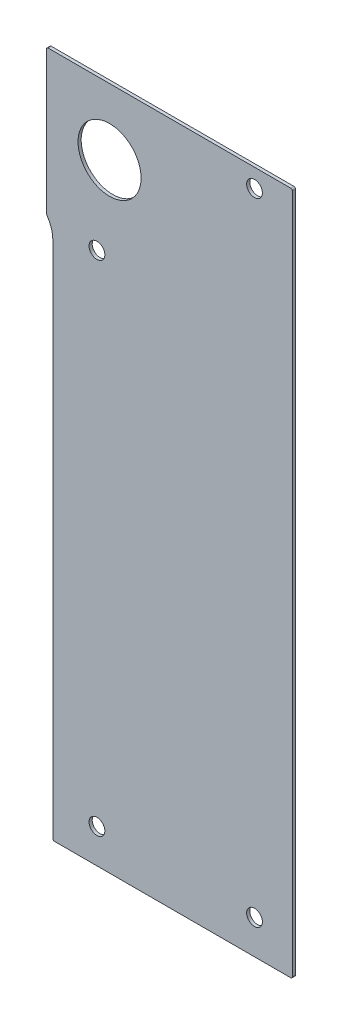
ISO-10303-21;
HEADER;
FILE_DESCRIPTION(('STEP AP214'),'2;1');
FILE_NAME('part.step','',(''),(''),'','','');
FILE_SCHEMA(('AUTOMOTIVE_DESIGN { 1 0 10303 214 1 1 1 1 }'));
ENDSEC;
DATA;
#1=APPLICATION_CONTEXT('core data for automotive mechanical design processes');
#2=APPLICATION_PROTOCOL_DEFINITION('international standard','automotive_design',2000,#1);
#3=PRODUCT_CONTEXT('',#1,'mechanical');
#4=PRODUCT('Part','Part','',(#3));
#5=PRODUCT_RELATED_PRODUCT_CATEGORY('part','',(#4));
#6=PRODUCT_DEFINITION_FORMATION('','',#4);
#7=PRODUCT_DEFINITION_CONTEXT('part definition',#1,'design');
#8=PRODUCT_DEFINITION('design','',#6,#7);
#9=PRODUCT_DEFINITION_SHAPE('','',#8);
#10=(LENGTH_UNIT() NAMED_UNIT(*) SI_UNIT(.MILLI.,.METRE.));
#11=(NAMED_UNIT(*) PLANE_ANGLE_UNIT() SI_UNIT($,.RADIAN.));
#12=(NAMED_UNIT(*) SI_UNIT($,.STERADIAN.) SOLID_ANGLE_UNIT());
#13=UNCERTAINTY_MEASURE_WITH_UNIT(LENGTH_MEASURE(1.E-05),#10,'distance_accuracy_value','');
#14=(GEOMETRIC_REPRESENTATION_CONTEXT(3) GLOBAL_UNCERTAINTY_ASSIGNED_CONTEXT((#13)) GLOBAL_UNIT_ASSIGNED_CONTEXT((#10,
#11,#12)) REPRESENTATION_CONTEXT('',''));
#15=CARTESIAN_POINT('',(0.,0.,0.));
#16=DIRECTION('',(0.,0.,1.));
#17=DIRECTION('',(1.,0.,0.));
#18=AXIS2_PLACEMENT_3D('',#15,#16,#17);
#19=CARTESIAN_POINT('',(0.,0.,1.));
#20=DIRECTION('',(0.,0.,1.));
#21=DIRECTION('',(1.,0.,0.));
#22=AXIS2_PLACEMENT_3D('',#19,#20,#21);
#23=PLANE('',#22);
#24=DIRECTION('',(-1.,0.,0.));
#25=VECTOR('',#24,1.);
#26=CARTESIAN_POINT('',(76.,217.,1.));
#27=LINE('',#26,#25);
#28=CARTESIAN_POINT('',(75.5,217.,1.));
#29=VERTEX_POINT('',#28);
#30=CARTESIAN_POINT('',(-1.5,217.,1.));
#31=VERTEX_POINT('',#30);
#32=EDGE_CURVE('E135',#29,#31,#27,.T.);
#33=ORIENTED_EDGE('',*,*,#32,.T.);
#34=CARTESIAN_POINT('',(-1.5,216.5,1.));
#35=DIRECTION('',(0.,0.,1.));
#36=DIRECTION('',(1.,0.,0.));
#37=AXIS2_PLACEMENT_3D('',#34,#35,#36);
#38=CIRCLE('',#37,0.5);
#39=CARTESIAN_POINT('',(-2.,216.5,1.));
#40=VERTEX_POINT('',#39);
#41=EDGE_CURVE('E54',#31,#40,#38,.T.);
#42=ORIENTED_EDGE('',*,*,#41,.T.);
#43=DIRECTION('',(0.,1.,0.));
#44=VECTOR('',#43,1.);
#45=CARTESIAN_POINT('',(-2.,217.,1.));
#46=LINE('',#45,#44);
#47=CARTESIAN_POINT('',(-1.99999999999999,171.633249580711,1.));
#48=VERTEX_POINT('',#47);
#49=EDGE_CURVE('E263',#48,#40,#46,.T.);
#50=ORIENTED_EDGE('',*,*,#49,.F.);
#51=CARTESIAN_POINT('',(0.,171.633249580711,1.));
#52=DIRECTION('',(0.,0.,1.));
#53=DIRECTION('',(1.,0.,0.));
#54=AXIS2_PLACEMENT_3D('',#51,#52,#53);
#55=CIRCLE('',#54,2.);
#56=CARTESIAN_POINT('',(-1.66666666666666,170.527707983926,1.));
#57=VERTEX_POINT('',#56);
#58=EDGE_CURVE('E185',#48,#57,#55,.T.);
#59=ORIENTED_EDGE('',*,*,#58,.T.);
#60=CARTESIAN_POINT('',(-10.,165.,1.));
#61=DIRECTION('',(0.,0.,1.));
#62=DIRECTION('',(1.,0.,0.));
#63=AXIS2_PLACEMENT_3D('',#60,#61,#62);
#64=CIRCLE('',#63,10.);
#65=CARTESIAN_POINT('',(0.,165.,1.));
#66=VERTEX_POINT('',#65);
#67=EDGE_CURVE('E176',#57,#66,#64,.F.);
#68=ORIENTED_EDGE('',*,*,#67,.T.);
#69=DIRECTION('',(0.,-1.,0.));
#70=VECTOR('',#69,1.);
#71=CARTESIAN_POINT('',(0.,0.,1.));
#72=LINE('',#71,#70);
#73=CARTESIAN_POINT('',(0.,0.5,1.));
#74=VERTEX_POINT('',#73);
#75=EDGE_CURVE('E142',#66,#74,#72,.T.);
#76=ORIENTED_EDGE('',*,*,#75,.T.);
#77=CARTESIAN_POINT('',(0.5,0.5,1.));
#78=DIRECTION('',(0.,0.,1.));
#79=DIRECTION('',(1.,0.,0.));
#80=AXIS2_PLACEMENT_3D('',#77,#78,#79);
#81=CIRCLE('',#80,0.5);
#82=CARTESIAN_POINT('',(0.5,0.,1.));
#83=VERTEX_POINT('',#82);
#84=EDGE_CURVE('E125',#74,#83,#81,.T.);
#85=ORIENTED_EDGE('',*,*,#84,.T.);
#86=DIRECTION('',(1.,0.,0.));
#87=VECTOR('',#86,1.);
#88=CARTESIAN_POINT('',(0.,0.,1.));
#89=LINE('',#88,#87);
#90=CARTESIAN_POINT('',(75.5,0.,1.));
#91=VERTEX_POINT('',#90);
#92=EDGE_CURVE('E145',#83,#91,#89,.T.);
#93=ORIENTED_EDGE('',*,*,#92,.T.);
#94=CARTESIAN_POINT('',(75.5,0.5,1.));
#95=DIRECTION('',(0.,0.,1.));
#96=DIRECTION('',(1.,0.,0.));
#97=AXIS2_PLACEMENT_3D('',#94,#95,#96);
#98=CIRCLE('',#97,0.5);
#99=CARTESIAN_POINT('',(76.,0.5,1.));
#100=VERTEX_POINT('',#99);
#101=EDGE_CURVE('E156',#91,#100,#98,.T.);
#102=ORIENTED_EDGE('',*,*,#101,.T.);
#103=DIRECTION('',(0.,1.,0.));
#104=VECTOR('',#103,1.);
#105=CARTESIAN_POINT('',(76.,0.,1.));
#106=LINE('',#105,#104);
#107=CARTESIAN_POINT('',(76.,216.5,1.));
#108=VERTEX_POINT('',#107);
#109=EDGE_CURVE('E192',#100,#108,#106,.T.);
#110=ORIENTED_EDGE('',*,*,#109,.T.);
#111=CARTESIAN_POINT('',(75.5,216.5,1.));
#112=DIRECTION('',(0.,0.,1.));
#113=DIRECTION('',(1.,0.,0.));
#114=AXIS2_PLACEMENT_3D('',#111,#112,#113);
#115=CIRCLE('',#114,0.5);
#116=EDGE_CURVE('E137',#108,#29,#115,.T.);
#117=ORIENTED_EDGE('',*,*,#116,.T.);
#118=EDGE_LOOP('',(#33,#42,#50,#59,#68,#76,#85,#93,#102,#110,#117));
#119=FACE_BOUND('',#118,.T.);
#120=CARTESIAN_POINT('',(18.0000000000003,196.,1.));
#121=DIRECTION('',(0.,0.,1.));
#122=DIRECTION('',(1.,0.,0.));
#123=AXIS2_PLACEMENT_3D('',#120,#121,#122);
#124=CIRCLE('',#123,10.);
#125=CARTESIAN_POINT('',(28.0000000000003,196.,1.));
#126=VERTEX_POINT('',#125);
#127=EDGE_CURVE('E410',#126,#126,#124,.T.);
#128=ORIENTED_EDGE('',*,*,#127,.F.);
#129=EDGE_LOOP('',(#128));
#130=FACE_BOUND('',#129,.T.);
#131=CARTESIAN_POINT('',(64.,10.85,1.));
#132=DIRECTION('',(0.,0.,1.));
#133=DIRECTION('',(1.,0.,0.));
#134=AXIS2_PLACEMENT_3D('',#131,#132,#133);
#135=CIRCLE('',#134,2.5);
#136=CARTESIAN_POINT('',(66.5,10.85,1.));
#137=VERTEX_POINT('',#136);
#138=EDGE_CURVE('E398',#137,#137,#135,.T.);
#139=ORIENTED_EDGE('',*,*,#138,.F.);
#140=EDGE_LOOP('',(#139));
#141=FACE_BOUND('',#140,.T.);
#142=CARTESIAN_POINT('',(14.,169.15,1.));
#143=DIRECTION('',(0.,0.,1.));
#144=DIRECTION('',(1.,0.,0.));
#145=AXIS2_PLACEMENT_3D('',#142,#143,#144);
#146=CIRCLE('',#145,2.5);
#147=CARTESIAN_POINT('',(16.5,169.15,1.));
#148=VERTEX_POINT('',#147);
#149=EDGE_CURVE('E198',#148,#148,#146,.T.);
#150=ORIENTED_EDGE('',*,*,#149,.F.);
#151=EDGE_LOOP('',(#150));
#152=FACE_BOUND('',#151,.T.);
#153=CARTESIAN_POINT('',(14.,10.85,1.));
#154=DIRECTION('',(0.,0.,1.));
#155=DIRECTION('',(1.,0.,0.));
#156=AXIS2_PLACEMENT_3D('',#153,#154,#155);
#157=CIRCLE('',#156,2.5);
#158=CARTESIAN_POINT('',(16.5,10.85,1.));
#159=VERTEX_POINT('',#158);
#160=EDGE_CURVE('E392',#159,#159,#157,.T.);
#161=ORIENTED_EDGE('',*,*,#160,.F.);
#162=EDGE_LOOP('',(#161));
#163=FACE_BOUND('',#162,.T.);
#164=CARTESIAN_POINT('',(64.,211.15,1.));
#165=DIRECTION('',(0.,0.,1.));
#166=DIRECTION('',(1.,0.,0.));
#167=AXIS2_PLACEMENT_3D('',#164,#165,#166);
#168=CIRCLE('',#167,2.5);
#169=CARTESIAN_POINT('',(66.5,211.15,1.));
#170=VERTEX_POINT('',#169);
#171=EDGE_CURVE('E404',#170,#170,#168,.T.);
#172=ORIENTED_EDGE('',*,*,#171,.F.);
#173=EDGE_LOOP('',(#172));
#174=FACE_BOUND('',#173,.T.);
#175=ADVANCED_FACE('F32',(#119,#130,#141,#152,#163,#174),#23,.T.);
#176=CARTESIAN_POINT('',(0.,0.,0.));
#177=DIRECTION('',(0.,0.,1.));
#178=DIRECTION('',(1.,0.,0.));
#179=AXIS2_PLACEMENT_3D('',#176,#177,#178);
#180=PLANE('',#179);
#181=CARTESIAN_POINT('',(18.0000000000003,196.,0.));
#182=DIRECTION('',(0.,0.,1.));
#183=DIRECTION('',(1.,0.,0.));
#184=AXIS2_PLACEMENT_3D('',#181,#182,#183);
#185=CIRCLE('',#184,10.);
#186=CARTESIAN_POINT('',(28.0000000000003,196.,0.));
#187=VERTEX_POINT('',#186);
#188=EDGE_CURVE('E413',#187,#187,#185,.T.);
#189=ORIENTED_EDGE('',*,*,#188,.T.);
#190=EDGE_LOOP('',(#189));
#191=FACE_BOUND('',#190,.T.);
#192=CARTESIAN_POINT('',(64.,10.85,0.));
#193=DIRECTION('',(0.,0.,1.));
#194=DIRECTION('',(1.,0.,0.));
#195=AXIS2_PLACEMENT_3D('',#192,#193,#194);
#196=CIRCLE('',#195,2.5);
#197=CARTESIAN_POINT('',(66.5,10.85,0.));
#198=VERTEX_POINT('',#197);
#199=EDGE_CURVE('E401',#198,#198,#196,.T.);
#200=ORIENTED_EDGE('',*,*,#199,.T.);
#201=EDGE_LOOP('',(#200));
#202=FACE_BOUND('',#201,.T.);
#203=CARTESIAN_POINT('',(14.,169.15,0.));
#204=DIRECTION('',(0.,0.,1.));
#205=DIRECTION('',(1.,0.,0.));
#206=AXIS2_PLACEMENT_3D('',#203,#204,#205);
#207=CIRCLE('',#206,2.5);
#208=CARTESIAN_POINT('',(16.5,169.15,0.));
#209=VERTEX_POINT('',#208);
#210=EDGE_CURVE('E389',#209,#209,#207,.T.);
#211=ORIENTED_EDGE('',*,*,#210,.T.);
#212=EDGE_LOOP('',(#211));
#213=FACE_BOUND('',#212,.T.);
#214=DIRECTION('',(0.,1.,0.));
#215=VECTOR('',#214,1.);
#216=CARTESIAN_POINT('',(-1.99999999999997,0.,0.));
#217=LINE('',#216,#215);
#218=CARTESIAN_POINT('',(-2.,171.633249580711,0.));
#219=VERTEX_POINT('',#218);
#220=CARTESIAN_POINT('',(-2.,216.5,0.));
#221=VERTEX_POINT('',#220);
#222=EDGE_CURVE('E266',#219,#221,#217,.T.);
#223=ORIENTED_EDGE('',*,*,#222,.T.);
#224=CARTESIAN_POINT('',(-1.5,216.5,0.));
#225=DIRECTION('',(0.,0.,1.));
#226=DIRECTION('',(1.,0.,0.));
#227=AXIS2_PLACEMENT_3D('',#224,#225,#226);
#228=CIRCLE('',#227,0.5);
#229=CARTESIAN_POINT('',(-1.5,217.,0.));
#230=VERTEX_POINT('',#229);
#231=EDGE_CURVE('E11',#221,#230,#228,.F.);
#232=ORIENTED_EDGE('',*,*,#231,.T.);
#233=DIRECTION('',(-1.,0.,0.));
#234=VECTOR('',#233,1.);
#235=CARTESIAN_POINT('',(76.,217.,0.));
#236=LINE('',#235,#234);
#237=CARTESIAN_POINT('',(75.5,217.,0.));
#238=VERTEX_POINT('',#237);
#239=EDGE_CURVE('E133',#238,#230,#236,.T.);
#240=ORIENTED_EDGE('',*,*,#239,.F.);
#241=CARTESIAN_POINT('',(75.5,216.5,0.));
#242=DIRECTION('',(0.,0.,1.));
#243=DIRECTION('',(1.,0.,0.));
#244=AXIS2_PLACEMENT_3D('',#241,#242,#243);
#245=CIRCLE('',#244,0.5);
#246=CARTESIAN_POINT('',(76.,216.5,0.));
#247=VERTEX_POINT('',#246);
#248=EDGE_CURVE('E115',#238,#247,#245,.F.);
#249=ORIENTED_EDGE('',*,*,#248,.T.);
#250=DIRECTION('',(0.,1.,0.));
#251=VECTOR('',#250,1.);
#252=CARTESIAN_POINT('',(76.,0.,0.));
#253=LINE('',#252,#251);
#254=CARTESIAN_POINT('',(76.,0.5,0.));
#255=VERTEX_POINT('',#254);
#256=EDGE_CURVE('E143',#255,#247,#253,.T.);
#257=ORIENTED_EDGE('',*,*,#256,.F.);
#258=CARTESIAN_POINT('',(75.5,0.5,0.));
#259=DIRECTION('',(0.,0.,1.));
#260=DIRECTION('',(1.,0.,0.));
#261=AXIS2_PLACEMENT_3D('',#258,#259,#260);
#262=CIRCLE('',#261,0.5);
#263=CARTESIAN_POINT('',(75.5,0.,0.));
#264=VERTEX_POINT('',#263);
#265=EDGE_CURVE('E126',#255,#264,#262,.F.);
#266=ORIENTED_EDGE('',*,*,#265,.T.);
#267=DIRECTION('',(1.,0.,0.));
#268=VECTOR('',#267,1.);
#269=CARTESIAN_POINT('',(0.,0.,0.));
#270=LINE('',#269,#268);
#271=CARTESIAN_POINT('',(0.5,0.,0.));
#272=VERTEX_POINT('',#271);
#273=EDGE_CURVE('E147',#272,#264,#270,.T.);
#274=ORIENTED_EDGE('',*,*,#273,.F.);
#275=CARTESIAN_POINT('',(0.5,0.5,0.));
#276=DIRECTION('',(0.,0.,1.));
#277=DIRECTION('',(1.,0.,0.));
#278=AXIS2_PLACEMENT_3D('',#275,#276,#277);
#279=CIRCLE('',#278,0.5);
#280=CARTESIAN_POINT('',(0.,0.5,0.));
#281=VERTEX_POINT('',#280);
#282=EDGE_CURVE('E151',#272,#281,#279,.F.);
#283=ORIENTED_EDGE('',*,*,#282,.T.);
#284=DIRECTION('',(0.,-1.,0.));
#285=VECTOR('',#284,1.);
#286=CARTESIAN_POINT('',(0.,0.,0.));
#287=LINE('',#286,#285);
#288=CARTESIAN_POINT('',(0.,165.,0.));
#289=VERTEX_POINT('',#288);
#290=EDGE_CURVE('E197',#289,#281,#287,.T.);
#291=ORIENTED_EDGE('',*,*,#290,.F.);
#292=CARTESIAN_POINT('',(-10.,165.,0.));
#293=DIRECTION('',(0.,0.,1.));
#294=DIRECTION('',(1.,0.,0.));
#295=AXIS2_PLACEMENT_3D('',#292,#293,#294);
#296=CIRCLE('',#295,10.);
#297=CARTESIAN_POINT('',(-1.66666666666666,170.527707983926,0.));
#298=VERTEX_POINT('',#297);
#299=EDGE_CURVE('E173',#289,#298,#296,.T.);
#300=ORIENTED_EDGE('',*,*,#299,.T.);
#301=CARTESIAN_POINT('',(0.,171.633249580711,0.));
#302=DIRECTION('',(0.,0.,1.));
#303=DIRECTION('',(1.,0.,0.));
#304=AXIS2_PLACEMENT_3D('',#301,#302,#303);
#305=CIRCLE('',#304,2.);
#306=EDGE_CURVE('E181',#298,#219,#305,.F.);
#307=ORIENTED_EDGE('',*,*,#306,.T.);
#308=EDGE_LOOP('',(#223,#232,#240,#249,#257,#266,#274,#283,#291,#300,#307));
#309=FACE_BOUND('',#308,.T.);
#310=CARTESIAN_POINT('',(14.,10.85,0.));
#311=DIRECTION('',(0.,0.,1.));
#312=DIRECTION('',(1.,0.,0.));
#313=AXIS2_PLACEMENT_3D('',#310,#311,#312);
#314=CIRCLE('',#313,2.5);
#315=CARTESIAN_POINT('',(16.5,10.85,0.));
#316=VERTEX_POINT('',#315);
#317=EDGE_CURVE('E395',#316,#316,#314,.T.);
#318=ORIENTED_EDGE('',*,*,#317,.T.);
#319=EDGE_LOOP('',(#318));
#320=FACE_BOUND('',#319,.T.);
#321=CARTESIAN_POINT('',(64.,211.15,0.));
#322=DIRECTION('',(0.,0.,1.));
#323=DIRECTION('',(1.,0.,0.));
#324=AXIS2_PLACEMENT_3D('',#321,#322,#323);
#325=CIRCLE('',#324,2.5);
#326=CARTESIAN_POINT('',(66.5,211.15,0.));
#327=VERTEX_POINT('',#326);
#328=EDGE_CURVE('E407',#327,#327,#325,.T.);
#329=ORIENTED_EDGE('',*,*,#328,.T.);
#330=EDGE_LOOP('',(#329));
#331=FACE_BOUND('',#330,.T.);
#332=ADVANCED_FACE('F139',(#191,#202,#213,#309,#320,#331),#180,.F.);
#333=CARTESIAN_POINT('',(0.,0.,1.));
#334=DIRECTION('',(1.,0.,0.));
#335=DIRECTION('',(0.,0.,-1.));
#336=AXIS2_PLACEMENT_3D('',#333,#334,#335);
#337=PLANE('',#336);
#338=ORIENTED_EDGE('',*,*,#75,.F.);
#339=DIRECTION('',(0.,0.,-1.));
#340=VECTOR('',#339,1.);
#341=CARTESIAN_POINT('',(0.,165.,0.));
#342=LINE('',#341,#340);
#343=EDGE_CURVE('E170',#66,#289,#342,.T.);
#344=ORIENTED_EDGE('',*,*,#343,.T.);
#345=ORIENTED_EDGE('',*,*,#290,.T.);
#346=DIRECTION('',(0.,0.,-1.));
#347=VECTOR('',#346,1.);
#348=CARTESIAN_POINT('',(0.,0.5,1.));
#349=LINE('',#348,#347);
#350=EDGE_CURVE('E167',#281,#74,#349,.F.);
#351=ORIENTED_EDGE('',*,*,#350,.T.);
#352=EDGE_LOOP('',(#338,#344,#345,#351));
#353=FACE_BOUND('',#352,.T.);
#354=ADVANCED_FACE('F222',(#353),#337,.F.);
#355=CARTESIAN_POINT('',(0.,0.,1.));
#356=DIRECTION('',(0.,1.,0.));
#357=DIRECTION('',(0.,0.,1.));
#358=AXIS2_PLACEMENT_3D('',#355,#356,#357);
#359=PLANE('',#358);
#360=ORIENTED_EDGE('',*,*,#273,.T.);
#361=DIRECTION('',(0.,0.,-1.));
#362=VECTOR('',#361,1.);
#363=CARTESIAN_POINT('',(75.5,0.,1.));
#364=LINE('',#363,#362);
#365=EDGE_CURVE('E165',#264,#91,#364,.F.);
#366=ORIENTED_EDGE('',*,*,#365,.T.);
#367=ORIENTED_EDGE('',*,*,#92,.F.);
#368=DIRECTION('',(0.,0.,-1.));
#369=VECTOR('',#368,1.);
#370=CARTESIAN_POINT('',(0.5,0.,1.));
#371=LINE('',#370,#369);
#372=EDGE_CURVE('E162',#83,#272,#371,.T.);
#373=ORIENTED_EDGE('',*,*,#372,.T.);
#374=EDGE_LOOP('',(#360,#366,#367,#373));
#375=FACE_BOUND('',#374,.T.);
#376=ADVANCED_FACE('F203',(#375),#359,.F.);
#377=CARTESIAN_POINT('',(76.,0.,1.));
#378=DIRECTION('',(-1.,0.,0.));
#379=DIRECTION('',(0.,0.,1.));
#380=AXIS2_PLACEMENT_3D('',#377,#378,#379);
#381=PLANE('',#380);
#382=ORIENTED_EDGE('',*,*,#256,.T.);
#383=DIRECTION('',(0.,0.,-1.));
#384=VECTOR('',#383,1.);
#385=CARTESIAN_POINT('',(76.,216.5,1.));
#386=LINE('',#385,#384);
#387=EDGE_CURVE('E120',#247,#108,#386,.F.);
#388=ORIENTED_EDGE('',*,*,#387,.T.);
#389=ORIENTED_EDGE('',*,*,#109,.F.);
#390=DIRECTION('',(0.,0.,-1.));
#391=VECTOR('',#390,1.);
#392=CARTESIAN_POINT('',(76.,0.5,1.));
#393=LINE('',#392,#391);
#394=EDGE_CURVE('E136',#100,#255,#393,.T.);
#395=ORIENTED_EDGE('',*,*,#394,.T.);
#396=EDGE_LOOP('',(#382,#388,#389,#395));
#397=FACE_BOUND('',#396,.T.);
#398=ADVANCED_FACE('F213',(#397),#381,.F.);
#399=CARTESIAN_POINT('',(76.,217.,1.));
#400=DIRECTION('',(0.,-1.,0.));
#401=DIRECTION('',(0.,0.,-1.));
#402=AXIS2_PLACEMENT_3D('',#399,#400,#401);
#403=PLANE('',#402);
#404=ORIENTED_EDGE('',*,*,#239,.T.);
#405=DIRECTION('',(0.,0.,1.));
#406=VECTOR('',#405,1.);
#407=CARTESIAN_POINT('',(-1.5,217.,1.));
#408=LINE('',#407,#406);
#409=EDGE_CURVE('E187',#230,#31,#408,.T.);
#410=ORIENTED_EDGE('',*,*,#409,.T.);
#411=ORIENTED_EDGE('',*,*,#32,.F.);
#412=DIRECTION('',(0.,0.,-1.));
#413=VECTOR('',#412,1.);
#414=CARTESIAN_POINT('',(75.5,217.,1.));
#415=LINE('',#414,#413);
#416=EDGE_CURVE('E119',#29,#238,#415,.T.);
#417=ORIENTED_EDGE('',*,*,#416,.T.);
#418=EDGE_LOOP('',(#404,#410,#411,#417));
#419=FACE_BOUND('',#418,.T.);
#420=ADVANCED_FACE('F131',(#419),#403,.F.);
#421=CARTESIAN_POINT('',(14.,169.15,1.));
#422=DIRECTION('',(0.,0.,-1.));
#423=DIRECTION('',(-1.,0.,0.));
#424=AXIS2_PLACEMENT_3D('',#421,#422,#423);
#425=CYLINDRICAL_SURFACE('',#424,2.5);
#426=ORIENTED_EDGE('',*,*,#149,.T.);
#427=EDGE_LOOP('',(#426));
#428=FACE_BOUND('',#427,.T.);
#429=ORIENTED_EDGE('',*,*,#210,.F.);
#430=EDGE_LOOP('',(#429));
#431=FACE_BOUND('',#430,.T.);
#432=ADVANCED_FACE('F220',(#428,#431),#425,.F.);
#433=CARTESIAN_POINT('',(14.,10.85,1.));
#434=DIRECTION('',(0.,0.,-1.));
#435=DIRECTION('',(-1.,0.,0.));
#436=AXIS2_PLACEMENT_3D('',#433,#434,#435);
#437=CYLINDRICAL_SURFACE('',#436,2.5);
#438=ORIENTED_EDGE('',*,*,#160,.T.);
#439=EDGE_LOOP('',(#438));
#440=FACE_BOUND('',#439,.T.);
#441=ORIENTED_EDGE('',*,*,#317,.F.);
#442=EDGE_LOOP('',(#441));
#443=FACE_BOUND('',#442,.T.);
#444=ADVANCED_FACE('F234',(#440,#443),#437,.F.);
#445=CARTESIAN_POINT('',(64.,10.85,1.));
#446=DIRECTION('',(0.,0.,-1.));
#447=DIRECTION('',(-1.,0.,0.));
#448=AXIS2_PLACEMENT_3D('',#445,#446,#447);
#449=CYLINDRICAL_SURFACE('',#448,2.5);
#450=ORIENTED_EDGE('',*,*,#138,.T.);
#451=EDGE_LOOP('',(#450));
#452=FACE_BOUND('',#451,.T.);
#453=ORIENTED_EDGE('',*,*,#199,.F.);
#454=EDGE_LOOP('',(#453));
#455=FACE_BOUND('',#454,.T.);
#456=ADVANCED_FACE('F238',(#452,#455),#449,.F.);
#457=CARTESIAN_POINT('',(64.,211.15,1.));
#458=DIRECTION('',(0.,0.,-1.));
#459=DIRECTION('',(-1.,0.,0.));
#460=AXIS2_PLACEMENT_3D('',#457,#458,#459);
#461=CYLINDRICAL_SURFACE('',#460,2.5);
#462=ORIENTED_EDGE('',*,*,#171,.T.);
#463=EDGE_LOOP('',(#462));
#464=FACE_BOUND('',#463,.T.);
#465=ORIENTED_EDGE('',*,*,#328,.F.);
#466=EDGE_LOOP('',(#465));
#467=FACE_BOUND('',#466,.T.);
#468=ADVANCED_FACE('F242',(#464,#467),#461,.F.);
#469=CARTESIAN_POINT('',(18.0000000000003,196.,1.));
#470=DIRECTION('',(0.,0.,-1.));
#471=DIRECTION('',(-1.,0.,0.));
#472=AXIS2_PLACEMENT_3D('',#469,#470,#471);
#473=CYLINDRICAL_SURFACE('',#472,10.);
#474=ORIENTED_EDGE('',*,*,#127,.T.);
#475=EDGE_LOOP('',(#474));
#476=FACE_BOUND('',#475,.T.);
#477=ORIENTED_EDGE('',*,*,#188,.F.);
#478=EDGE_LOOP('',(#477));
#479=FACE_BOUND('',#478,.T.);
#480=ADVANCED_FACE('F246',(#476,#479),#473,.F.);
#481=CARTESIAN_POINT('',(75.5,216.5,1.));
#482=DIRECTION('',(0.,0.,-1.));
#483=DIRECTION('',(-1.,0.,0.));
#484=AXIS2_PLACEMENT_3D('',#481,#482,#483);
#485=CYLINDRICAL_SURFACE('',#484,0.5);
#486=ORIENTED_EDGE('',*,*,#116,.F.);
#487=ORIENTED_EDGE('',*,*,#387,.F.);
#488=ORIENTED_EDGE('',*,*,#248,.F.);
#489=ORIENTED_EDGE('',*,*,#416,.F.);
#490=EDGE_LOOP('',(#486,#487,#488,#489));
#491=FACE_BOUND('',#490,.T.);
#492=ADVANCED_FACE('F118',(#491),#485,.T.);
#493=CARTESIAN_POINT('',(75.5,0.5,1.));
#494=DIRECTION('',(0.,0.,-1.));
#495=DIRECTION('',(-1.,0.,0.));
#496=AXIS2_PLACEMENT_3D('',#493,#494,#495);
#497=CYLINDRICAL_SURFACE('',#496,0.5);
#498=ORIENTED_EDGE('',*,*,#101,.F.);
#499=ORIENTED_EDGE('',*,*,#365,.F.);
#500=ORIENTED_EDGE('',*,*,#265,.F.);
#501=ORIENTED_EDGE('',*,*,#394,.F.);
#502=EDGE_LOOP('',(#498,#499,#500,#501));
#503=FACE_BOUND('',#502,.T.);
#504=ADVANCED_FACE('F209',(#503),#497,.T.);
#505=CARTESIAN_POINT('',(0.5,0.5,1.));
#506=DIRECTION('',(0.,0.,-1.));
#507=DIRECTION('',(-1.,0.,0.));
#508=AXIS2_PLACEMENT_3D('',#505,#506,#507);
#509=CYLINDRICAL_SURFACE('',#508,0.5);
#510=ORIENTED_EDGE('',*,*,#84,.F.);
#511=ORIENTED_EDGE('',*,*,#350,.F.);
#512=ORIENTED_EDGE('',*,*,#282,.F.);
#513=ORIENTED_EDGE('',*,*,#372,.F.);
#514=EDGE_LOOP('',(#510,#511,#512,#513));
#515=FACE_BOUND('',#514,.T.);
#516=ADVANCED_FACE('F260',(#515),#509,.T.);
#517=CARTESIAN_POINT('',(-10.,165.,1.));
#518=DIRECTION('',(0.,0.,1.));
#519=DIRECTION('',(1.,0.,0.));
#520=AXIS2_PLACEMENT_3D('',#517,#518,#519);
#521=CYLINDRICAL_SURFACE('',#520,10.);
#522=ORIENTED_EDGE('',*,*,#67,.F.);
#523=DIRECTION('',(0.,0.,1.));
#524=VECTOR('',#523,1.);
#525=CARTESIAN_POINT('',(-1.66666666666666,170.527707983926,1.));
#526=LINE('',#525,#524);
#527=EDGE_CURVE('E178',#57,#298,#526,.F.);
#528=ORIENTED_EDGE('',*,*,#527,.T.);
#529=ORIENTED_EDGE('',*,*,#299,.F.);
#530=ORIENTED_EDGE('',*,*,#343,.F.);
#531=EDGE_LOOP('',(#522,#528,#529,#530));
#532=FACE_BOUND('',#531,.T.);
#533=ADVANCED_FACE('F254',(#532),#521,.F.);
#534=CARTESIAN_POINT('',(-2.,217.,-9.));
#535=DIRECTION('',(1.,0.,0.));
#536=DIRECTION('',(0.,1.,0.));
#537=AXIS2_PLACEMENT_3D('',#534,#535,#536);
#538=PLANE('',#537);
#539=ORIENTED_EDGE('',*,*,#49,.T.);
#540=DIRECTION('',(0.,0.,1.));
#541=VECTOR('',#540,1.);
#542=CARTESIAN_POINT('',(-2.,216.5,-9.));
#543=LINE('',#542,#541);
#544=EDGE_CURVE('E40',#40,#221,#543,.F.);
#545=ORIENTED_EDGE('',*,*,#544,.T.);
#546=ORIENTED_EDGE('',*,*,#222,.F.);
#547=DIRECTION('',(0.,0.,1.));
#548=VECTOR('',#547,1.);
#549=CARTESIAN_POINT('',(-1.99999999999999,171.633249580711,-9.));
#550=LINE('',#549,#548);
#551=EDGE_CURVE('E183',#219,#48,#550,.T.);
#552=ORIENTED_EDGE('',*,*,#551,.T.);
#553=EDGE_LOOP('',(#539,#545,#546,#552));
#554=FACE_BOUND('',#553,.T.);
#555=ADVANCED_FACE('F251',(#554),#538,.F.);
#556=CARTESIAN_POINT('',(0.,171.633249580711,1.));
#557=DIRECTION('',(0.,0.,1.));
#558=DIRECTION('',(1.,0.,0.));
#559=AXIS2_PLACEMENT_3D('',#556,#557,#558);
#560=CYLINDRICAL_SURFACE('',#559,2.);
#561=ORIENTED_EDGE('',*,*,#58,.F.);
#562=ORIENTED_EDGE('',*,*,#551,.F.);
#563=ORIENTED_EDGE('',*,*,#306,.F.);
#564=ORIENTED_EDGE('',*,*,#527,.F.);
#565=EDGE_LOOP('',(#561,#562,#563,#564));
#566=FACE_BOUND('',#565,.T.);
#567=ADVANCED_FACE('F253',(#566),#560,.T.);
#568=CARTESIAN_POINT('',(-1.5,216.5,1.));
#569=DIRECTION('',(0.,0.,1.));
#570=DIRECTION('',(1.,0.,0.));
#571=AXIS2_PLACEMENT_3D('',#568,#569,#570);
#572=CYLINDRICAL_SURFACE('',#571,0.5);
#573=ORIENTED_EDGE('',*,*,#231,.F.);
#574=ORIENTED_EDGE('',*,*,#544,.F.);
#575=ORIENTED_EDGE('',*,*,#41,.F.);
#576=ORIENTED_EDGE('',*,*,#409,.F.);
#577=EDGE_LOOP('',(#573,#574,#575,#576));
#578=FACE_BOUND('',#577,.T.);
#579=ADVANCED_FACE('F34',(#578),#572,.T.);
#580=CLOSED_SHELL('',(#175,#332,#354,#376,#398,#420,#432,#444,#456,#468,#480,#492,#504,#516,
#533,#555,#567,#579));
#581=MANIFOLD_SOLID_BREP('B2',#580);
#582=ADVANCED_BREP_SHAPE_REPRESENTATION('',(#18,#581),#14);
#583=SHAPE_DEFINITION_REPRESENTATION(#9,#582);
ENDSEC;
END-ISO-10303-21;
